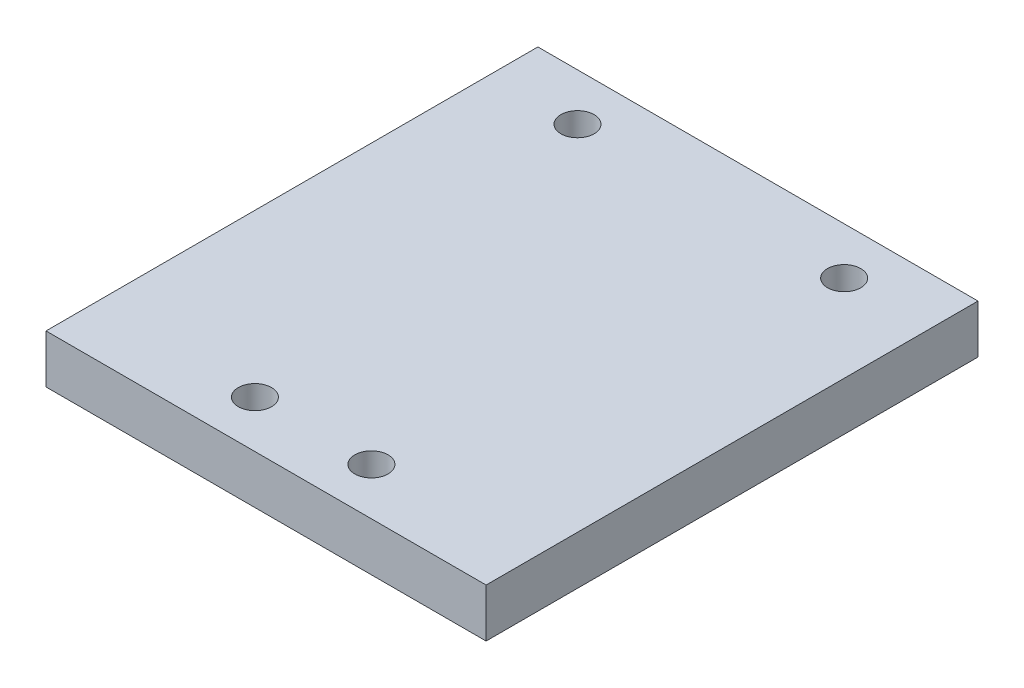
ISO-10303-21;
HEADER;
FILE_DESCRIPTION(('STEP AP214'),'2;1');
FILE_NAME('part.step','',(''),(''),'','','');
FILE_SCHEMA(('AUTOMOTIVE_DESIGN { 1 0 10303 214 1 1 1 1 }'));
ENDSEC;
DATA;
#1=APPLICATION_CONTEXT('core data for automotive mechanical design processes');
#2=APPLICATION_PROTOCOL_DEFINITION('international standard','automotive_design',2000,#1);
#3=PRODUCT_CONTEXT('',#1,'mechanical');
#4=PRODUCT('Part','Part','',(#3));
#5=PRODUCT_RELATED_PRODUCT_CATEGORY('part','',(#4));
#6=PRODUCT_DEFINITION_FORMATION('','',#4);
#7=PRODUCT_DEFINITION_CONTEXT('part definition',#1,'design');
#8=PRODUCT_DEFINITION('design','',#6,#7);
#9=PRODUCT_DEFINITION_SHAPE('','',#8);
#10=(LENGTH_UNIT() NAMED_UNIT(*) SI_UNIT(.MILLI.,.METRE.));
#11=(NAMED_UNIT(*) PLANE_ANGLE_UNIT() SI_UNIT($,.RADIAN.));
#12=(NAMED_UNIT(*) SI_UNIT($,.STERADIAN.) SOLID_ANGLE_UNIT());
#13=UNCERTAINTY_MEASURE_WITH_UNIT(LENGTH_MEASURE(1.E-05),#10,'distance_accuracy_value','');
#14=(GEOMETRIC_REPRESENTATION_CONTEXT(3) GLOBAL_UNCERTAINTY_ASSIGNED_CONTEXT((#13)) GLOBAL_UNIT_ASSIGNED_CONTEXT((#10,
#11,#12)) REPRESENTATION_CONTEXT('',''));
#15=CARTESIAN_POINT('',(0.,0.,0.));
#16=DIRECTION('',(0.,0.,1.));
#17=DIRECTION('',(1.,0.,0.));
#18=AXIS2_PLACEMENT_3D('',#15,#16,#17);
#19=CARTESIAN_POINT('',(21.59,4.7625,24.13));
#20=DIRECTION('',(-1.,0.,0.));
#21=DIRECTION('',(0.,0.,1.));
#22=AXIS2_PLACEMENT_3D('',#19,#20,#21);
#23=PLANE('',#22);
#24=DIRECTION('',(0.,0.,-1.));
#25=VECTOR('',#24,1.);
#26=CARTESIAN_POINT('',(21.59,0.,24.13));
#27=LINE('',#26,#25);
#28=CARTESIAN_POINT('',(21.59,0.,24.13));
#29=VERTEX_POINT('',#28);
#30=CARTESIAN_POINT('',(21.59,0.,-24.13));
#31=VERTEX_POINT('',#30);
#32=EDGE_CURVE('E100',#29,#31,#27,.T.);
#33=ORIENTED_EDGE('',*,*,#32,.T.);
#34=DIRECTION('',(0.,-1.,0.));
#35=VECTOR('',#34,1.);
#36=CARTESIAN_POINT('',(21.59,4.7625,-24.13));
#37=LINE('',#36,#35);
#38=CARTESIAN_POINT('',(21.59,4.7625,-24.13));
#39=VERTEX_POINT('',#38);
#40=EDGE_CURVE('E11',#39,#31,#37,.T.);
#41=ORIENTED_EDGE('',*,*,#40,.F.);
#42=DIRECTION('',(0.,0.,-1.));
#43=VECTOR('',#42,1.);
#44=CARTESIAN_POINT('',(21.59,4.7625,24.13));
#45=LINE('',#44,#43);
#46=CARTESIAN_POINT('',(21.59,4.7625,24.13));
#47=VERTEX_POINT('',#46);
#48=EDGE_CURVE('E88',#47,#39,#45,.T.);
#49=ORIENTED_EDGE('',*,*,#48,.F.);
#50=DIRECTION('',(0.,-1.,0.));
#51=VECTOR('',#50,1.);
#52=CARTESIAN_POINT('',(21.59,4.7625,24.13));
#53=LINE('',#52,#51);
#54=EDGE_CURVE('E96',#47,#29,#53,.T.);
#55=ORIENTED_EDGE('',*,*,#54,.T.);
#56=EDGE_LOOP('',(#33,#41,#49,#55));
#57=FACE_BOUND('',#56,.T.);
#58=ADVANCED_FACE('F37',(#57),#23,.F.);
#59=CARTESIAN_POINT('',(-21.59,4.7625,-24.13));
#60=DIRECTION('',(0.,0.,1.));
#61=DIRECTION('',(1.,0.,0.));
#62=AXIS2_PLACEMENT_3D('',#59,#60,#61);
#63=PLANE('',#62);
#64=DIRECTION('',(-1.,0.,0.));
#65=VECTOR('',#64,1.);
#66=CARTESIAN_POINT('',(-21.59,0.,-24.13));
#67=LINE('',#66,#65);
#68=CARTESIAN_POINT('',(-21.59,0.,-24.13));
#69=VERTEX_POINT('',#68);
#70=EDGE_CURVE('E92',#31,#69,#67,.T.);
#71=ORIENTED_EDGE('',*,*,#70,.T.);
#72=DIRECTION('',(0.,-1.,0.));
#73=VECTOR('',#72,1.);
#74=CARTESIAN_POINT('',(-21.59,4.7625,-24.13));
#75=LINE('',#74,#73);
#76=CARTESIAN_POINT('',(-21.59,4.7625,-24.13));
#77=VERTEX_POINT('',#76);
#78=EDGE_CURVE('E45',#77,#69,#75,.T.);
#79=ORIENTED_EDGE('',*,*,#78,.F.);
#80=DIRECTION('',(-1.,0.,0.));
#81=VECTOR('',#80,1.);
#82=CARTESIAN_POINT('',(-21.59,4.7625,-24.13));
#83=LINE('',#82,#81);
#84=EDGE_CURVE('E83',#39,#77,#83,.T.);
#85=ORIENTED_EDGE('',*,*,#84,.F.);
#86=ORIENTED_EDGE('',*,*,#40,.T.);
#87=EDGE_LOOP('',(#71,#79,#85,#86));
#88=FACE_BOUND('',#87,.T.);
#89=ADVANCED_FACE('F91',(#88),#63,.F.);
#90=CARTESIAN_POINT('',(-21.59,4.7625,24.13));
#91=DIRECTION('',(1.,0.,0.));
#92=DIRECTION('',(0.,0.,-1.));
#93=AXIS2_PLACEMENT_3D('',#90,#91,#92);
#94=PLANE('',#93);
#95=DIRECTION('',(0.,0.,1.));
#96=VECTOR('',#95,1.);
#97=CARTESIAN_POINT('',(-21.59,0.,24.13));
#98=LINE('',#97,#96);
#99=CARTESIAN_POINT('',(-21.59,0.,24.13));
#100=VERTEX_POINT('',#99);
#101=EDGE_CURVE('E70',#69,#100,#98,.T.);
#102=ORIENTED_EDGE('',*,*,#101,.T.);
#103=DIRECTION('',(0.,-1.,0.));
#104=VECTOR('',#103,1.);
#105=CARTESIAN_POINT('',(-21.59,4.7625,24.13));
#106=LINE('',#105,#104);
#107=CARTESIAN_POINT('',(-21.59,4.7625,24.13));
#108=VERTEX_POINT('',#107);
#109=EDGE_CURVE('E93',#108,#100,#106,.T.);
#110=ORIENTED_EDGE('',*,*,#109,.F.);
#111=DIRECTION('',(0.,0.,1.));
#112=VECTOR('',#111,1.);
#113=CARTESIAN_POINT('',(-21.59,4.7625,24.13));
#114=LINE('',#113,#112);
#115=EDGE_CURVE('E86',#77,#108,#114,.T.);
#116=ORIENTED_EDGE('',*,*,#115,.F.);
#117=ORIENTED_EDGE('',*,*,#78,.T.);
#118=EDGE_LOOP('',(#102,#110,#116,#117));
#119=FACE_BOUND('',#118,.T.);
#120=ADVANCED_FACE('F94',(#119),#94,.F.);
#121=CARTESIAN_POINT('',(-21.59,4.7625,24.13));
#122=DIRECTION('',(0.,0.,-1.));
#123=DIRECTION('',(-1.,0.,0.));
#124=AXIS2_PLACEMENT_3D('',#121,#122,#123);
#125=PLANE('',#124);
#126=DIRECTION('',(1.,0.,0.));
#127=VECTOR('',#126,1.);
#128=CARTESIAN_POINT('',(-21.59,0.,24.13));
#129=LINE('',#128,#127);
#130=EDGE_CURVE('E76',#100,#29,#129,.T.);
#131=ORIENTED_EDGE('',*,*,#130,.T.);
#132=ORIENTED_EDGE('',*,*,#54,.F.);
#133=DIRECTION('',(1.,0.,0.));
#134=VECTOR('',#133,1.);
#135=CARTESIAN_POINT('',(-21.59,4.7625,24.13));
#136=LINE('',#135,#134);
#137=EDGE_CURVE('E53',#108,#47,#136,.T.);
#138=ORIENTED_EDGE('',*,*,#137,.F.);
#139=ORIENTED_EDGE('',*,*,#109,.T.);
#140=EDGE_LOOP('',(#131,#132,#138,#139));
#141=FACE_BOUND('',#140,.T.);
#142=ADVANCED_FACE('F108',(#141),#125,.F.);
#143=CARTESIAN_POINT('',(0.,4.7625,0.));
#144=DIRECTION('',(0.,-1.,0.));
#145=DIRECTION('',(0.,0.,-1.));
#146=AXIS2_PLACEMENT_3D('',#143,#144,#145);
#147=PLANE('',#146);
#148=CARTESIAN_POINT('',(5.715,4.7625,19.5072));
#149=DIRECTION('',(0.,-1.,0.));
#150=DIRECTION('',(0.,0.,-1.));
#151=AXIS2_PLACEMENT_3D('',#148,#149,#150);
#152=CIRCLE('',#151,1.63195);
#153=CARTESIAN_POINT('',(5.715,4.7625,17.87525));
#154=VERTEX_POINT('',#153);
#155=EDGE_CURVE('E158',#154,#154,#152,.T.);
#156=ORIENTED_EDGE('',*,*,#155,.T.);
#157=EDGE_LOOP('',(#156));
#158=FACE_BOUND('',#157,.T.);
#159=CARTESIAN_POINT('',(-5.715,4.7625,19.5072));
#160=DIRECTION('',(0.,-1.,0.));
#161=DIRECTION('',(0.,0.,-1.));
#162=AXIS2_PLACEMENT_3D('',#159,#160,#161);
#163=CIRCLE('',#162,1.63195);
#164=CARTESIAN_POINT('',(-5.715,4.7625,17.87525));
#165=VERTEX_POINT('',#164);
#166=EDGE_CURVE('E143',#165,#165,#163,.T.);
#167=ORIENTED_EDGE('',*,*,#166,.T.);
#168=EDGE_LOOP('',(#167));
#169=FACE_BOUND('',#168,.T.);
#170=CARTESIAN_POINT('',(-13.081,4.7625,-19.5072));
#171=DIRECTION('',(0.,-1.,0.));
#172=DIRECTION('',(0.,0.,-1.));
#173=AXIS2_PLACEMENT_3D('',#170,#171,#172);
#174=CIRCLE('',#173,1.63195);
#175=CARTESIAN_POINT('',(-13.081,4.7625,-21.13915));
#176=VERTEX_POINT('',#175);
#177=EDGE_CURVE('E128',#176,#176,#174,.T.);
#178=ORIENTED_EDGE('',*,*,#177,.T.);
#179=EDGE_LOOP('',(#178));
#180=FACE_BOUND('',#179,.T.);
#181=CARTESIAN_POINT('',(13.081,4.7625,-19.5072));
#182=DIRECTION('',(0.,-1.,0.));
#183=DIRECTION('',(0.,0.,-1.));
#184=AXIS2_PLACEMENT_3D('',#181,#182,#183);
#185=CIRCLE('',#184,1.63195);
#186=CARTESIAN_POINT('',(13.081,4.7625,-21.13915));
#187=VERTEX_POINT('',#186);
#188=EDGE_CURVE('E103',#187,#187,#185,.T.);
#189=ORIENTED_EDGE('',*,*,#188,.T.);
#190=EDGE_LOOP('',(#189));
#191=FACE_BOUND('',#190,.T.);
#192=ORIENTED_EDGE('',*,*,#48,.T.);
#193=ORIENTED_EDGE('',*,*,#84,.T.);
#194=ORIENTED_EDGE('',*,*,#115,.T.);
#195=ORIENTED_EDGE('',*,*,#137,.T.);
#196=EDGE_LOOP('',(#192,#193,#194,#195));
#197=FACE_BOUND('',#196,.T.);
#198=ADVANCED_FACE('F84',(#158,#169,#180,#191,#197),#147,.F.);
#199=CARTESIAN_POINT('',(0.,0.,0.));
#200=DIRECTION('',(0.,-1.,0.));
#201=DIRECTION('',(0.,0.,-1.));
#202=AXIS2_PLACEMENT_3D('',#199,#200,#201);
#203=PLANE('',#202);
#204=CARTESIAN_POINT('',(5.715,0.,19.5072));
#205=DIRECTION('',(0.,-1.,0.));
#206=DIRECTION('',(0.,0.,-1.));
#207=AXIS2_PLACEMENT_3D('',#204,#205,#206);
#208=CIRCLE('',#207,4.00812);
#209=CARTESIAN_POINT('',(5.715,0.,15.49908));
#210=VERTEX_POINT('',#209);
#211=EDGE_CURVE('E170',#210,#210,#208,.T.);
#212=ORIENTED_EDGE('',*,*,#211,.F.);
#213=EDGE_LOOP('',(#212));
#214=FACE_BOUND('',#213,.T.);
#215=CARTESIAN_POINT('',(-5.715,0.,19.5072));
#216=DIRECTION('',(0.,-1.,0.));
#217=DIRECTION('',(0.,0.,-1.));
#218=AXIS2_PLACEMENT_3D('',#215,#216,#217);
#219=CIRCLE('',#218,4.00812);
#220=CARTESIAN_POINT('',(-5.715,0.,15.49908));
#221=VERTEX_POINT('',#220);
#222=EDGE_CURVE('E155',#221,#221,#219,.T.);
#223=ORIENTED_EDGE('',*,*,#222,.F.);
#224=EDGE_LOOP('',(#223));
#225=FACE_BOUND('',#224,.T.);
#226=CARTESIAN_POINT('',(-13.081,0.,-19.5072));
#227=DIRECTION('',(0.,-1.,0.));
#228=DIRECTION('',(0.,0.,-1.));
#229=AXIS2_PLACEMENT_3D('',#226,#227,#228);
#230=CIRCLE('',#229,4.00812);
#231=CARTESIAN_POINT('',(-13.081,0.,-23.51532));
#232=VERTEX_POINT('',#231);
#233=EDGE_CURVE('E140',#232,#232,#230,.T.);
#234=ORIENTED_EDGE('',*,*,#233,.F.);
#235=EDGE_LOOP('',(#234));
#236=FACE_BOUND('',#235,.T.);
#237=CARTESIAN_POINT('',(13.081,0.,-19.5072));
#238=DIRECTION('',(0.,-1.,0.));
#239=DIRECTION('',(0.,0.,-1.));
#240=AXIS2_PLACEMENT_3D('',#237,#238,#239);
#241=CIRCLE('',#240,4.00812);
#242=CARTESIAN_POINT('',(13.081,0.,-23.51532));
#243=VERTEX_POINT('',#242);
#244=EDGE_CURVE('E125',#243,#243,#241,.T.);
#245=ORIENTED_EDGE('',*,*,#244,.F.);
#246=EDGE_LOOP('',(#245));
#247=FACE_BOUND('',#246,.T.);
#248=ORIENTED_EDGE('',*,*,#32,.F.);
#249=ORIENTED_EDGE('',*,*,#130,.F.);
#250=ORIENTED_EDGE('',*,*,#101,.F.);
#251=ORIENTED_EDGE('',*,*,#70,.F.);
#252=EDGE_LOOP('',(#248,#249,#250,#251));
#253=FACE_BOUND('',#252,.T.);
#254=ADVANCED_FACE('F111',(#214,#225,#236,#247,#253),#203,.T.);
#255=CARTESIAN_POINT('',(13.081,0.,-19.5072));
#256=DIRECTION('',(0.,-1.,0.));
#257=DIRECTION('',(0.,0.,-1.));
#258=AXIS2_PLACEMENT_3D('',#255,#256,#257);
#259=CYLINDRICAL_SURFACE('',#258,1.63195);
#260=ORIENTED_EDGE('',*,*,#188,.F.);
#261=EDGE_LOOP('',(#260));
#262=FACE_BOUND('',#261,.T.);
#263=CARTESIAN_POINT('',(13.081,1.7272,-19.5072));
#264=DIRECTION('',(0.,-1.,0.));
#265=DIRECTION('',(0.,0.,-1.));
#266=AXIS2_PLACEMENT_3D('',#263,#264,#265);
#267=CIRCLE('',#266,1.63195);
#268=CARTESIAN_POINT('',(13.081,1.7272,-21.13915));
#269=VERTEX_POINT('',#268);
#270=EDGE_CURVE('E116',#269,#269,#267,.T.);
#271=ORIENTED_EDGE('',*,*,#270,.T.);
#272=EDGE_LOOP('',(#271));
#273=FACE_BOUND('',#272,.T.);
#274=ADVANCED_FACE('F178',(#262,#273),#259,.F.);
#275=CARTESIAN_POINT('',(16.45412,1.7272,-19.5072));
#276=DIRECTION('',(0.,1.,0.));
#277=DIRECTION('',(0.,0.,1.));
#278=AXIS2_PLACEMENT_3D('',#275,#276,#277);
#279=PLANE('',#278);
#280=ORIENTED_EDGE('',*,*,#270,.F.);
#281=EDGE_LOOP('',(#280));
#282=FACE_BOUND('',#281,.T.);
#283=CARTESIAN_POINT('',(13.081,1.7272,-19.5072));
#284=DIRECTION('',(0.,-1.,0.));
#285=DIRECTION('',(0.,0.,-1.));
#286=AXIS2_PLACEMENT_3D('',#283,#284,#285);
#287=CIRCLE('',#286,3.37312);
#288=CARTESIAN_POINT('',(13.081,1.7272,-22.88032));
#289=VERTEX_POINT('',#288);
#290=EDGE_CURVE('E119',#289,#289,#287,.T.);
#291=ORIENTED_EDGE('',*,*,#290,.T.);
#292=EDGE_LOOP('',(#291));
#293=FACE_BOUND('',#292,.T.);
#294=ADVANCED_FACE('F199',(#282,#293),#279,.F.);
#295=CARTESIAN_POINT('',(13.081,0.,-19.5072));
#296=DIRECTION('',(0.,-1.,0.));
#297=DIRECTION('',(0.,0.,-1.));
#298=AXIS2_PLACEMENT_3D('',#295,#296,#297);
#299=CYLINDRICAL_SURFACE('',#298,3.37312);
#300=ORIENTED_EDGE('',*,*,#290,.F.);
#301=EDGE_LOOP('',(#300));
#302=FACE_BOUND('',#301,.T.);
#303=CARTESIAN_POINT('',(13.081,0.634999999999999,-19.5072));
#304=DIRECTION('',(0.,-1.,0.));
#305=DIRECTION('',(0.,0.,-1.));
#306=AXIS2_PLACEMENT_3D('',#303,#304,#305);
#307=CIRCLE('',#306,3.37312);
#308=CARTESIAN_POINT('',(13.081,0.634999999999999,-22.88032));
#309=VERTEX_POINT('',#308);
#310=EDGE_CURVE('E122',#309,#309,#307,.T.);
#311=ORIENTED_EDGE('',*,*,#310,.T.);
#312=EDGE_LOOP('',(#311));
#313=FACE_BOUND('',#312,.T.);
#314=ADVANCED_FACE('F189',(#302,#313),#299,.F.);
#315=CARTESIAN_POINT('',(13.081,0.,-19.5072));
#316=DIRECTION('',(0.,-1.,0.));
#317=DIRECTION('',(0.,0.,-1.));
#318=AXIS2_PLACEMENT_3D('',#315,#316,#317);
#319=CONICAL_SURFACE('',#318,4.00812,0.785398163397447);
#320=ORIENTED_EDGE('',*,*,#310,.F.);
#321=EDGE_LOOP('',(#320));
#322=FACE_BOUND('',#321,.T.);
#323=ORIENTED_EDGE('',*,*,#244,.T.);
#324=EDGE_LOOP('',(#323));
#325=FACE_BOUND('',#324,.T.);
#326=ADVANCED_FACE('F186',(#322,#325),#319,.F.);
#327=CARTESIAN_POINT('',(-13.081,0.,-19.5072));
#328=DIRECTION('',(0.,-1.,0.));
#329=DIRECTION('',(0.,0.,-1.));
#330=AXIS2_PLACEMENT_3D('',#327,#328,#329);
#331=CYLINDRICAL_SURFACE('',#330,1.63195);
#332=ORIENTED_EDGE('',*,*,#177,.F.);
#333=EDGE_LOOP('',(#332));
#334=FACE_BOUND('',#333,.T.);
#335=CARTESIAN_POINT('',(-13.081,1.7272,-19.5072));
#336=DIRECTION('',(0.,-1.,0.));
#337=DIRECTION('',(0.,0.,-1.));
#338=AXIS2_PLACEMENT_3D('',#335,#336,#337);
#339=CIRCLE('',#338,1.63195);
#340=CARTESIAN_POINT('',(-13.081,1.7272,-21.13915));
#341=VERTEX_POINT('',#340);
#342=EDGE_CURVE('E131',#341,#341,#339,.T.);
#343=ORIENTED_EDGE('',*,*,#342,.T.);
#344=EDGE_LOOP('',(#343));
#345=FACE_BOUND('',#344,.T.);
#346=ADVANCED_FACE('F188',(#334,#345),#331,.F.);
#347=CARTESIAN_POINT('',(-9.70788,1.7272,-19.5072));
#348=DIRECTION('',(0.,1.,0.));
#349=DIRECTION('',(0.,0.,1.));
#350=AXIS2_PLACEMENT_3D('',#347,#348,#349);
#351=PLANE('',#350);
#352=ORIENTED_EDGE('',*,*,#342,.F.);
#353=EDGE_LOOP('',(#352));
#354=FACE_BOUND('',#353,.T.);
#355=CARTESIAN_POINT('',(-13.081,1.7272,-19.5072));
#356=DIRECTION('',(0.,-1.,0.));
#357=DIRECTION('',(0.,0.,-1.));
#358=AXIS2_PLACEMENT_3D('',#355,#356,#357);
#359=CIRCLE('',#358,3.37312);
#360=CARTESIAN_POINT('',(-13.081,1.7272,-22.88032));
#361=VERTEX_POINT('',#360);
#362=EDGE_CURVE('E134',#361,#361,#359,.T.);
#363=ORIENTED_EDGE('',*,*,#362,.T.);
#364=EDGE_LOOP('',(#363));
#365=FACE_BOUND('',#364,.T.);
#366=ADVANCED_FACE('F196',(#354,#365),#351,.F.);
#367=CARTESIAN_POINT('',(-13.081,0.,-19.5072));
#368=DIRECTION('',(0.,-1.,0.));
#369=DIRECTION('',(0.,0.,-1.));
#370=AXIS2_PLACEMENT_3D('',#367,#368,#369);
#371=CYLINDRICAL_SURFACE('',#370,3.37312);
#372=ORIENTED_EDGE('',*,*,#362,.F.);
#373=EDGE_LOOP('',(#372));
#374=FACE_BOUND('',#373,.T.);
#375=CARTESIAN_POINT('',(-13.081,0.634999999999999,-19.5072));
#376=DIRECTION('',(0.,-1.,0.));
#377=DIRECTION('',(0.,0.,-1.));
#378=AXIS2_PLACEMENT_3D('',#375,#376,#377);
#379=CIRCLE('',#378,3.37312);
#380=CARTESIAN_POINT('',(-13.081,0.634999999999999,-22.88032));
#381=VERTEX_POINT('',#380);
#382=EDGE_CURVE('E137',#381,#381,#379,.T.);
#383=ORIENTED_EDGE('',*,*,#382,.T.);
#384=EDGE_LOOP('',(#383));
#385=FACE_BOUND('',#384,.T.);
#386=ADVANCED_FACE('F257',(#374,#385),#371,.F.);
#387=CARTESIAN_POINT('',(-13.081,0.,-19.5072));
#388=DIRECTION('',(0.,-1.,0.));
#389=DIRECTION('',(0.,0.,-1.));
#390=AXIS2_PLACEMENT_3D('',#387,#388,#389);
#391=CONICAL_SURFACE('',#390,4.00812,0.785398163397447);
#392=ORIENTED_EDGE('',*,*,#382,.F.);
#393=EDGE_LOOP('',(#392));
#394=FACE_BOUND('',#393,.T.);
#395=ORIENTED_EDGE('',*,*,#233,.T.);
#396=EDGE_LOOP('',(#395));
#397=FACE_BOUND('',#396,.T.);
#398=ADVANCED_FACE('F267',(#394,#397),#391,.F.);
#399=CARTESIAN_POINT('',(-5.715,0.,19.5072));
#400=DIRECTION('',(0.,-1.,0.));
#401=DIRECTION('',(0.,0.,-1.));
#402=AXIS2_PLACEMENT_3D('',#399,#400,#401);
#403=CYLINDRICAL_SURFACE('',#402,1.63195);
#404=ORIENTED_EDGE('',*,*,#166,.F.);
#405=EDGE_LOOP('',(#404));
#406=FACE_BOUND('',#405,.T.);
#407=CARTESIAN_POINT('',(-5.715,1.7272,19.5072));
#408=DIRECTION('',(0.,-1.,0.));
#409=DIRECTION('',(0.,0.,-1.));
#410=AXIS2_PLACEMENT_3D('',#407,#408,#409);
#411=CIRCLE('',#410,1.63195);
#412=CARTESIAN_POINT('',(-5.715,1.7272,17.87525));
#413=VERTEX_POINT('',#412);
#414=EDGE_CURVE('E146',#413,#413,#411,.T.);
#415=ORIENTED_EDGE('',*,*,#414,.T.);
#416=EDGE_LOOP('',(#415));
#417=FACE_BOUND('',#416,.T.);
#418=ADVANCED_FACE('F277',(#406,#417),#403,.F.);
#419=CARTESIAN_POINT('',(-2.34188000000001,1.7272,19.5072));
#420=DIRECTION('',(0.,1.,0.));
#421=DIRECTION('',(0.,0.,1.));
#422=AXIS2_PLACEMENT_3D('',#419,#420,#421);
#423=PLANE('',#422);
#424=ORIENTED_EDGE('',*,*,#414,.F.);
#425=EDGE_LOOP('',(#424));
#426=FACE_BOUND('',#425,.T.);
#427=CARTESIAN_POINT('',(-5.715,1.7272,19.5072));
#428=DIRECTION('',(0.,-1.,0.));
#429=DIRECTION('',(0.,0.,-1.));
#430=AXIS2_PLACEMENT_3D('',#427,#428,#429);
#431=CIRCLE('',#430,3.37312);
#432=CARTESIAN_POINT('',(-5.715,1.7272,16.13408));
#433=VERTEX_POINT('',#432);
#434=EDGE_CURVE('E149',#433,#433,#431,.T.);
#435=ORIENTED_EDGE('',*,*,#434,.T.);
#436=EDGE_LOOP('',(#435));
#437=FACE_BOUND('',#436,.T.);
#438=ADVANCED_FACE('F288',(#426,#437),#423,.F.);
#439=CARTESIAN_POINT('',(-5.715,0.,19.5072));
#440=DIRECTION('',(0.,-1.,0.));
#441=DIRECTION('',(0.,0.,-1.));
#442=AXIS2_PLACEMENT_3D('',#439,#440,#441);
#443=CYLINDRICAL_SURFACE('',#442,3.37312);
#444=ORIENTED_EDGE('',*,*,#434,.F.);
#445=EDGE_LOOP('',(#444));
#446=FACE_BOUND('',#445,.T.);
#447=CARTESIAN_POINT('',(-5.715,0.634999999999999,19.5072));
#448=DIRECTION('',(0.,-1.,0.));
#449=DIRECTION('',(0.,0.,-1.));
#450=AXIS2_PLACEMENT_3D('',#447,#448,#449);
#451=CIRCLE('',#450,3.37312);
#452=CARTESIAN_POINT('',(-5.715,0.634999999999999,16.13408));
#453=VERTEX_POINT('',#452);
#454=EDGE_CURVE('E152',#453,#453,#451,.T.);
#455=ORIENTED_EDGE('',*,*,#454,.T.);
#456=EDGE_LOOP('',(#455));
#457=FACE_BOUND('',#456,.T.);
#458=ADVANCED_FACE('F298',(#446,#457),#443,.F.);
#459=CARTESIAN_POINT('',(-5.715,0.,19.5072));
#460=DIRECTION('',(0.,-1.,0.));
#461=DIRECTION('',(0.,0.,-1.));
#462=AXIS2_PLACEMENT_3D('',#459,#460,#461);
#463=CONICAL_SURFACE('',#462,4.00812,0.785398163397447);
#464=ORIENTED_EDGE('',*,*,#454,.F.);
#465=EDGE_LOOP('',(#464));
#466=FACE_BOUND('',#465,.T.);
#467=ORIENTED_EDGE('',*,*,#222,.T.);
#468=EDGE_LOOP('',(#467));
#469=FACE_BOUND('',#468,.T.);
#470=ADVANCED_FACE('F308',(#466,#469),#463,.F.);
#471=CARTESIAN_POINT('',(5.715,0.,19.5072));
#472=DIRECTION('',(0.,-1.,0.));
#473=DIRECTION('',(0.,0.,-1.));
#474=AXIS2_PLACEMENT_3D('',#471,#472,#473);
#475=CYLINDRICAL_SURFACE('',#474,1.63195);
#476=ORIENTED_EDGE('',*,*,#155,.F.);
#477=EDGE_LOOP('',(#476));
#478=FACE_BOUND('',#477,.T.);
#479=CARTESIAN_POINT('',(5.715,1.7272,19.5072));
#480=DIRECTION('',(0.,-1.,0.));
#481=DIRECTION('',(0.,0.,-1.));
#482=AXIS2_PLACEMENT_3D('',#479,#480,#481);
#483=CIRCLE('',#482,1.63195);
#484=CARTESIAN_POINT('',(5.715,1.7272,17.87525));
#485=VERTEX_POINT('',#484);
#486=EDGE_CURVE('E161',#485,#485,#483,.T.);
#487=ORIENTED_EDGE('',*,*,#486,.T.);
#488=EDGE_LOOP('',(#487));
#489=FACE_BOUND('',#488,.T.);
#490=ADVANCED_FACE('F318',(#478,#489),#475,.F.);
#491=CARTESIAN_POINT('',(9.08811999999999,1.7272,19.5072));
#492=DIRECTION('',(0.,1.,0.));
#493=DIRECTION('',(0.,0.,1.));
#494=AXIS2_PLACEMENT_3D('',#491,#492,#493);
#495=PLANE('',#494);
#496=ORIENTED_EDGE('',*,*,#486,.F.);
#497=EDGE_LOOP('',(#496));
#498=FACE_BOUND('',#497,.T.);
#499=CARTESIAN_POINT('',(5.715,1.7272,19.5072));
#500=DIRECTION('',(0.,-1.,0.));
#501=DIRECTION('',(0.,0.,-1.));
#502=AXIS2_PLACEMENT_3D('',#499,#500,#501);
#503=CIRCLE('',#502,3.37312);
#504=CARTESIAN_POINT('',(5.715,1.7272,16.13408));
#505=VERTEX_POINT('',#504);
#506=EDGE_CURVE('E164',#505,#505,#503,.T.);
#507=ORIENTED_EDGE('',*,*,#506,.T.);
#508=EDGE_LOOP('',(#507));
#509=FACE_BOUND('',#508,.T.);
#510=ADVANCED_FACE('F329',(#498,#509),#495,.F.);
#511=CARTESIAN_POINT('',(5.715,0.,19.5072));
#512=DIRECTION('',(0.,-1.,0.));
#513=DIRECTION('',(0.,0.,-1.));
#514=AXIS2_PLACEMENT_3D('',#511,#512,#513);
#515=CYLINDRICAL_SURFACE('',#514,3.37312);
#516=ORIENTED_EDGE('',*,*,#506,.F.);
#517=EDGE_LOOP('',(#516));
#518=FACE_BOUND('',#517,.T.);
#519=CARTESIAN_POINT('',(5.715,0.634999999999999,19.5072));
#520=DIRECTION('',(0.,-1.,0.));
#521=DIRECTION('',(0.,0.,-1.));
#522=AXIS2_PLACEMENT_3D('',#519,#520,#521);
#523=CIRCLE('',#522,3.37312);
#524=CARTESIAN_POINT('',(5.715,0.634999999999999,16.13408));
#525=VERTEX_POINT('',#524);
#526=EDGE_CURVE('E167',#525,#525,#523,.T.);
#527=ORIENTED_EDGE('',*,*,#526,.T.);
#528=EDGE_LOOP('',(#527));
#529=FACE_BOUND('',#528,.T.);
#530=ADVANCED_FACE('F339',(#518,#529),#515,.F.);
#531=CARTESIAN_POINT('',(5.715,0.,19.5072));
#532=DIRECTION('',(0.,-1.,0.));
#533=DIRECTION('',(0.,0.,-1.));
#534=AXIS2_PLACEMENT_3D('',#531,#532,#533);
#535=CONICAL_SURFACE('',#534,4.00812,0.785398163397447);
#536=ORIENTED_EDGE('',*,*,#526,.F.);
#537=EDGE_LOOP('',(#536));
#538=FACE_BOUND('',#537,.T.);
#539=ORIENTED_EDGE('',*,*,#211,.T.);
#540=EDGE_LOOP('',(#539));
#541=FACE_BOUND('',#540,.T.);
#542=ADVANCED_FACE('F174',(#538,#541),#535,.F.);
#543=CLOSED_SHELL('',(#58,#89,#120,#142,#198,#254,#274,#294,#314,#326,#346,#366,#386,#398,#418,
#438,#458,#470,#490,#510,#530,#542));
#544=MANIFOLD_SOLID_BREP('B2',#543);
#545=ADVANCED_BREP_SHAPE_REPRESENTATION('',(#18,#544),#14);
#546=SHAPE_DEFINITION_REPRESENTATION(#9,#545);
ENDSEC;
END-ISO-10303-21;
